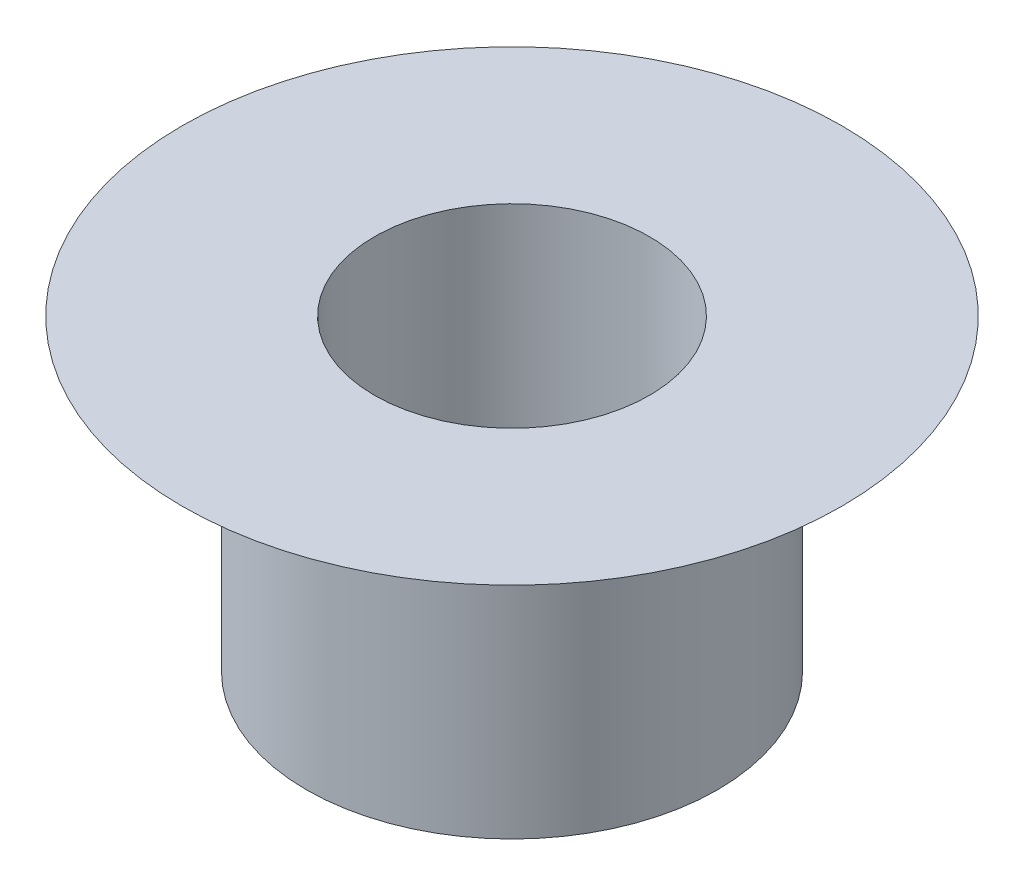
ISO-10303-21;
HEADER;
FILE_DESCRIPTION(('STEP AP214'),'2;1');
FILE_NAME('part.step','',(''),(''),'','','');
FILE_SCHEMA(('AUTOMOTIVE_DESIGN { 1 0 10303 214 1 1 1 1 }'));
ENDSEC;
DATA;
#1=APPLICATION_CONTEXT('core data for automotive mechanical design processes');
#2=APPLICATION_PROTOCOL_DEFINITION('international standard','automotive_design',2000,#1);
#3=PRODUCT_CONTEXT('',#1,'mechanical');
#4=PRODUCT('Part','Part','',(#3));
#5=PRODUCT_RELATED_PRODUCT_CATEGORY('part','',(#4));
#6=PRODUCT_DEFINITION_FORMATION('','',#4);
#7=PRODUCT_DEFINITION_CONTEXT('part definition',#1,'design');
#8=PRODUCT_DEFINITION('design','',#6,#7);
#9=PRODUCT_DEFINITION_SHAPE('','',#8);
#10=(LENGTH_UNIT() NAMED_UNIT(*) SI_UNIT(.MILLI.,.METRE.));
#11=(NAMED_UNIT(*) PLANE_ANGLE_UNIT() SI_UNIT($,.RADIAN.));
#12=(NAMED_UNIT(*) SI_UNIT($,.STERADIAN.) SOLID_ANGLE_UNIT());
#13=UNCERTAINTY_MEASURE_WITH_UNIT(LENGTH_MEASURE(1.E-05),#10,'distance_accuracy_value','');
#14=(GEOMETRIC_REPRESENTATION_CONTEXT(3) GLOBAL_UNCERTAINTY_ASSIGNED_CONTEXT((#13)) GLOBAL_UNIT_ASSIGNED_CONTEXT((#10,
#11,#12)) REPRESENTATION_CONTEXT('',''));
#15=CARTESIAN_POINT('',(0.,0.,0.));
#16=DIRECTION('',(0.,0.,1.));
#17=DIRECTION('',(1.,0.,0.));
#18=AXIS2_PLACEMENT_3D('',#15,#16,#17);
#19=CARTESIAN_POINT('',(0.,-49.5162454335061,0.));
#20=DIRECTION('',(0.,-1.,0.));
#21=DIRECTION('',(0.,0.,-1.));
#22=AXIS2_PLACEMENT_3D('',#19,#20,#21);
#23=PLANE('',#22);
#24=CARTESIAN_POINT('',(0.,-49.5162454335061,0.));
#25=DIRECTION('',(0.,1.,0.));
#26=DIRECTION('',(0.,0.,1.));
#27=AXIS2_PLACEMENT_3D('',#24,#25,#26);
#28=CIRCLE('',#27,28.7798243579346);
#29=CARTESIAN_POINT('',(0.,-49.5162454335061,28.7798243579346));
#30=VERTEX_POINT('',#29);
#31=EDGE_CURVE('E51',#30,#30,#28,.T.);
#32=ORIENTED_EDGE('',*,*,#31,.T.);
#33=EDGE_LOOP('',(#32));
#34=FACE_BOUND('',#33,.T.);
#35=CARTESIAN_POINT('',(0.,-49.5162454335061,0.));
#36=DIRECTION('',(0.,1.,0.));
#37=DIRECTION('',(0.,0.,1.));
#38=AXIS2_PLACEMENT_3D('',#35,#36,#37);
#39=CIRCLE('',#38,43.);
#40=CARTESIAN_POINT('',(0.,-49.5162454335061,43.));
#41=VERTEX_POINT('',#40);
#42=EDGE_CURVE('E10',#41,#41,#39,.T.);
#43=ORIENTED_EDGE('',*,*,#42,.F.);
#44=EDGE_LOOP('',(#43));
#45=FACE_BOUND('',#44,.T.);
#46=ADVANCED_FACE('F40',(#34,#45),#23,.T.);
#47=CARTESIAN_POINT('',(0.,75.5154695973094,0.));
#48=DIRECTION('',(0.,1.,0.));
#49=DIRECTION('',(0.,0.,1.));
#50=AXIS2_PLACEMENT_3D('',#47,#48,#49);
#51=CYLINDRICAL_SURFACE('',#50,43.);
#52=ORIENTED_EDGE('',*,*,#42,.T.);
#53=EDGE_LOOP('',(#52));
#54=FACE_BOUND('',#53,.T.);
#55=CARTESIAN_POINT('',(0.,4.48375456649391,0.));
#56=DIRECTION('',(0.,1.,0.));
#57=DIRECTION('',(0.,0.,1.));
#58=AXIS2_PLACEMENT_3D('',#55,#56,#57);
#59=CIRCLE('',#58,43.);
#60=CARTESIAN_POINT('',(0.,4.48375456649391,43.));
#61=VERTEX_POINT('',#60);
#62=EDGE_CURVE('E43',#61,#61,#59,.T.);
#63=ORIENTED_EDGE('',*,*,#62,.F.);
#64=EDGE_LOOP('',(#63));
#65=FACE_BOUND('',#64,.T.);
#66=ADVANCED_FACE('F78',(#54,#65),#51,.T.);
#67=CARTESIAN_POINT('',(0.,14.8775163658218,0.));
#68=DIRECTION('',(0.,1.,0.));
#69=DIRECTION('',(0.,0.,1.));
#70=AXIS2_PLACEMENT_3D('',#67,#68,#69);
#71=CONICAL_SURFACE('',#70,68.9994176023009,1.19048908278534);
#72=ORIENTED_EDGE('',*,*,#62,.T.);
#73=EDGE_LOOP('',(#72));
#74=FACE_BOUND('',#73,.T.);
#75=CARTESIAN_POINT('',(0.,14.8775163658218,0.));
#76=DIRECTION('',(0.,1.,0.));
#77=DIRECTION('',(0.,0.,1.));
#78=AXIS2_PLACEMENT_3D('',#75,#76,#77);
#79=CIRCLE('',#78,68.9994176023009);
#80=CARTESIAN_POINT('',(0.,14.8775163658218,68.9994176023009));
#81=VERTEX_POINT('',#80);
#82=EDGE_CURVE('E50',#81,#81,#79,.T.);
#83=ORIENTED_EDGE('',*,*,#82,.F.);
#84=EDGE_LOOP('',(#83));
#85=FACE_BOUND('',#84,.T.);
#86=ADVANCED_FACE('F72',(#74,#85),#71,.T.);
#87=CARTESIAN_POINT('',(-68.9994176023009,14.8775163658218,0.));
#88=DIRECTION('',(0.,1.,0.));
#89=DIRECTION('',(0.,0.,1.));
#90=AXIS2_PLACEMENT_3D('',#87,#88,#89);
#91=PLANE('',#90);
#92=CARTESIAN_POINT('',(0.,14.8775163658218,0.));
#93=DIRECTION('',(0.,1.,0.));
#94=DIRECTION('',(0.,0.,1.));
#95=AXIS2_PLACEMENT_3D('',#92,#93,#94);
#96=CIRCLE('',#95,28.7798243579346);
#97=CARTESIAN_POINT('',(0.,14.8775163658218,28.7798243579346));
#98=VERTEX_POINT('',#97);
#99=EDGE_CURVE('E53',#98,#98,#96,.T.);
#100=ORIENTED_EDGE('',*,*,#99,.F.);
#101=EDGE_LOOP('',(#100));
#102=FACE_BOUND('',#101,.T.);
#103=ORIENTED_EDGE('',*,*,#82,.T.);
#104=EDGE_LOOP('',(#103));
#105=FACE_BOUND('',#104,.T.);
#106=ADVANCED_FACE('F61',(#102,#105),#91,.T.);
#107=CARTESIAN_POINT('',(0.,-49.5162454335061,0.));
#108=DIRECTION('',(0.,1.,0.));
#109=DIRECTION('',(0.,0.,1.));
#110=AXIS2_PLACEMENT_3D('',#107,#108,#109);
#111=CYLINDRICAL_SURFACE('',#110,28.7798243579346);
#112=ORIENTED_EDGE('',*,*,#31,.F.);
#113=EDGE_LOOP('',(#112));
#114=FACE_BOUND('',#113,.T.);
#115=ORIENTED_EDGE('',*,*,#99,.T.);
#116=EDGE_LOOP('',(#115));
#117=FACE_BOUND('',#116,.T.);
#118=ADVANCED_FACE('F65',(#114,#117),#111,.F.);
#119=CLOSED_SHELL('',(#46,#66,#86,#106,#118));
#120=MANIFOLD_SOLID_BREP('B2',#119);
#121=ADVANCED_BREP_SHAPE_REPRESENTATION('',(#18,#120),#14);
#122=SHAPE_DEFINITION_REPRESENTATION(#9,#121);
ENDSEC;
END-ISO-10303-21;
